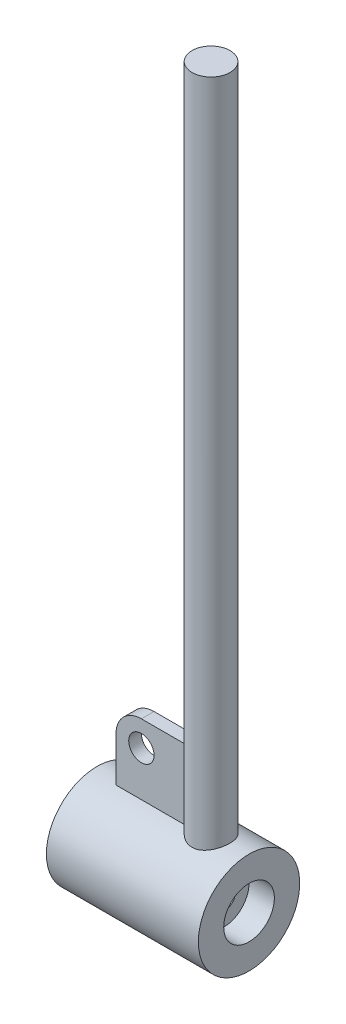
ISO-10303-21;
HEADER;
FILE_DESCRIPTION(('STEP AP214'),'2;1');
FILE_NAME('part.step','',(''),(''),'','','');
FILE_SCHEMA(('AUTOMOTIVE_DESIGN { 1 0 10303 214 1 1 1 1 }'));
ENDSEC;
DATA;
#1=APPLICATION_CONTEXT('core data for automotive mechanical design processes');
#2=APPLICATION_PROTOCOL_DEFINITION('international standard','automotive_design',2000,#1);
#3=PRODUCT_CONTEXT('',#1,'mechanical');
#4=PRODUCT('Part','Part','',(#3));
#5=PRODUCT_RELATED_PRODUCT_CATEGORY('part','',(#4));
#6=PRODUCT_DEFINITION_FORMATION('','',#4);
#7=PRODUCT_DEFINITION_CONTEXT('part definition',#1,'design');
#8=PRODUCT_DEFINITION('design','',#6,#7);
#9=PRODUCT_DEFINITION_SHAPE('','',#8);
#10=(LENGTH_UNIT() NAMED_UNIT(*) SI_UNIT(.MILLI.,.METRE.));
#11=(NAMED_UNIT(*) PLANE_ANGLE_UNIT() SI_UNIT($,.RADIAN.));
#12=(NAMED_UNIT(*) SI_UNIT($,.STERADIAN.) SOLID_ANGLE_UNIT());
#13=UNCERTAINTY_MEASURE_WITH_UNIT(LENGTH_MEASURE(1.E-05),#10,'distance_accuracy_value','');
#14=(GEOMETRIC_REPRESENTATION_CONTEXT(3) GLOBAL_UNCERTAINTY_ASSIGNED_CONTEXT((#13)) GLOBAL_UNIT_ASSIGNED_CONTEXT((#10,
#11,#12)) REPRESENTATION_CONTEXT('',''));
#15=CARTESIAN_POINT('',(0.,0.,0.));
#16=DIRECTION('',(0.,0.,1.));
#17=DIRECTION('',(1.,0.,0.));
#18=AXIS2_PLACEMENT_3D('',#15,#16,#17);
#19=CARTESIAN_POINT('',(-28.575,6.35,0.));
#20=DIRECTION('',(1.,0.,0.));
#21=DIRECTION('',(0.,0.,-1.));
#22=AXIS2_PLACEMENT_3D('',#19,#20,#21);
#23=PLANE('',#22);
#24=CARTESIAN_POINT('',(-28.575,0.,0.));
#25=DIRECTION('',(-1.,0.,0.));
#26=DIRECTION('',(0.,0.,1.));
#27=AXIS2_PLACEMENT_3D('',#24,#25,#26);
#28=CIRCLE('',#27,6.35);
#29=CARTESIAN_POINT('',(-28.575,0.,6.35));
#30=VERTEX_POINT('',#29);
#31=EDGE_CURVE('E119',#30,#30,#28,.T.);
#32=ORIENTED_EDGE('',*,*,#31,.F.);
#33=EDGE_LOOP('',(#32));
#34=FACE_BOUND('',#33,.T.);
#35=CARTESIAN_POINT('',(-28.575,0.,0.));
#36=DIRECTION('',(-1.,0.,0.));
#37=DIRECTION('',(0.,0.,1.));
#38=AXIS2_PLACEMENT_3D('',#35,#36,#37);
#39=CIRCLE('',#38,12.7);
#40=CARTESIAN_POINT('',(-28.575,0.,12.7));
#41=VERTEX_POINT('',#40);
#42=EDGE_CURVE('E165',#41,#41,#39,.T.);
#43=ORIENTED_EDGE('',*,*,#42,.T.);
#44=EDGE_LOOP('',(#43));
#45=FACE_BOUND('',#44,.T.);
#46=ADVANCED_FACE('F31',(#34,#45),#23,.F.);
#47=CARTESIAN_POINT('',(-58.6433500715651,0.,0.));
#48=DIRECTION('',(-1.,0.,0.));
#49=DIRECTION('',(0.,0.,1.));
#50=AXIS2_PLACEMENT_3D('',#47,#48,#49);
#51=CYLINDRICAL_SURFACE('',#50,12.7);
#52=CARTESIAN_POINT('',(0.,11.7732150982644,4.7625));
#53=CARTESIAN_POINT('',(0.128567071697956,11.7732145312841,4.76250062113983));
#54=CARTESIAN_POINT('',(0.257125703016878,11.7753267257476,4.75728965945919));
#55=CARTESIAN_POINT('',(0.513310022643079,11.7837043708982,4.7365006159302));
#56=CARTESIAN_POINT('',(0.640935395208131,11.7899711669087,4.72091917595606));
#57=CARTESIAN_POINT('',(0.894202915787573,11.8064485749458,4.67955822512454));
#58=CARTESIAN_POINT('',(1.01984589820061,11.8166574789881,4.65378313072177));
#59=CARTESIAN_POINT('',(1.26836519243568,11.8406941266636,4.59228170841132));
#60=CARTESIAN_POINT('',(1.39124038812537,11.8545233027994,4.55655144098841));
#61=CARTESIAN_POINT('',(1.63302026727132,11.8853277367461,4.47558411204013));
#62=CARTESIAN_POINT('',(1.75193522703316,11.9022939569003,4.43037431163132));
#63=CARTESIAN_POINT('',(1.98544395373294,11.9388968297245,4.33076841493963));
#64=CARTESIAN_POINT('',(2.10003608583932,11.9585344800118,4.27636888500565));
#65=CARTESIAN_POINT('',(2.43627441928944,12.0206332426824,4.09999159534038));
#66=CARTESIAN_POINT('',(2.65055933236497,12.066303970892,3.96477550461342));
#67=CARTESIAN_POINT('',(3.06356428259551,12.163543145445,3.65589073750445));
#68=CARTESIAN_POINT('',(3.26114315336497,12.2152848534884,3.48076037525215));
#69=CARTESIAN_POINT('',(3.62495986264481,12.3174033347767,3.10006102046914));
#70=CARTESIAN_POINT('',(3.7911910157797,12.3677798149089,2.89448555171005));
#71=CARTESIAN_POINT('',(4.09302078565285,12.463554098497,2.45012934039051));
#72=CARTESIAN_POINT('',(4.22738459037625,12.5087241627453,2.21045674015049));
#73=CARTESIAN_POINT('',(4.45341671487642,12.5869066593033,1.70991489416189));
#74=CARTESIAN_POINT('',(4.54509984218674,12.6199233072573,1.44905303670965));
#75=CARTESIAN_POINT('',(4.67918150939357,12.6688436566044,0.925478579929677));
#76=CARTESIAN_POINT('',(4.72353526802282,12.685424064373,0.663331130000924));
#77=CARTESIAN_POINT('',(4.76796476211752,12.7020324416252,0.134824376409631));
#78=CARTESIAN_POINT('',(4.76805489562662,12.7020657935245,-0.131533529485931));
#79=CARTESIAN_POINT('',(4.72509292000223,12.6860066940157,-0.646885754541797));
#80=CARTESIAN_POINT('',(4.68417498240438,12.6707119588141,-0.896087167420274));
#81=CARTESIAN_POINT('',(4.56394846576677,12.6267614786799,-1.38378951567748));
#82=CARTESIAN_POINT('',(4.48463716815508,12.598104787614,-1.62228969201198));
#83=CARTESIAN_POINT('',(4.28888381685542,12.5297491711813,-2.0859401303221));
#84=CARTESIAN_POINT('',(4.17191823351315,12.4898956281952,-2.31084562059769));
#85=CARTESIAN_POINT('',(3.90464009200877,12.4031790996323,-2.73839498017975));
#86=CARTESIAN_POINT('',(3.75431677688411,12.3563138545638,-2.94103163680303));
#87=CARTESIAN_POINT('',(3.41430836608794,12.2571678165392,-3.33086229554757));
#88=CARTESIAN_POINT('',(3.22283481769307,12.2047305993449,-3.5164590109288));
#89=CARTESIAN_POINT('',(2.81116724632091,12.1025431256601,-3.85351005960945));
#90=CARTESIAN_POINT('',(2.59096603209199,12.0527935463766,-4.00495581808559));
#91=CARTESIAN_POINT('',(2.12179069027205,11.9606283355181,-4.27245817380878));
#92=CARTESIAN_POINT('',(1.8722864055456,11.918399997197,-4.38765466511856));
#93=CARTESIAN_POINT('',(1.35541948774059,11.8482249228897,-4.57379274977756));
#94=CARTESIAN_POINT('',(1.08806688394957,11.8202702414014,-4.64475896899297));
#95=CARTESIAN_POINT('',(0.558876311393927,11.7836822147864,-4.73678857282724));
#96=CARTESIAN_POINT('',(0.297547935141986,11.7740679397346,-4.76038924588605));
#97=CARTESIAN_POINT('',(-0.225454677881716,11.7724726216055,-4.76433791985004));
#98=CARTESIAN_POINT('',(-0.487128811889495,11.7804871720852,-4.74469672934732));
#99=CARTESIAN_POINT('',(-0.990377608832013,11.8122503955975,-4.66501885864571));
#100=CARTESIAN_POINT('',(-1.23231674129102,11.8352341250036,-4.60694397296307));
#101=CARTESIAN_POINT('',(-1.70290433916944,11.8934383585691,-4.45451850412389));
#102=CARTESIAN_POINT('',(-1.9315500705441,11.9286613696537,-4.36016048881079));
#103=CARTESIAN_POINT('',(-2.37859858052653,12.0090011254105,-4.13385673094159));
#104=CARTESIAN_POINT('',(-2.59629615800392,12.0544392355119,-4.00063463273473));
#105=CARTESIAN_POINT('',(-3.00712885943932,12.1495428100892,-3.70178402231716));
#106=CARTESIAN_POINT('',(-3.20025495084908,12.1992098179852,-3.53614364952475));
#107=CARTESIAN_POINT('',(-3.56925706882868,12.3010053631771,-3.1645708368274));
#108=CARTESIAN_POINT('',(-3.74326346164424,12.353090349699,-2.95674982098713));
#109=CARTESIAN_POINT('',(-3.97631066699626,12.4263515418137,-2.62464031005532));
#110=CARTESIAN_POINT('',(-4.04936630002418,12.4499729561772,-2.51046996452995));
#111=CARTESIAN_POINT('',(-4.18564094214861,12.4949607835956,-2.2759985402175));
#112=CARTESIAN_POINT('',(-4.24886415978381,12.5163281601724,-2.15570011384761));
#113=CARTESIAN_POINT('',(-4.36477232952835,12.5561489522204,-1.91011979704122));
#114=CARTESIAN_POINT('',(-4.4174881475595,12.5746108679449,-1.78485383871892));
#115=CARTESIAN_POINT('',(-4.5121192567724,12.6081662504861,-1.52992166068614));
#116=CARTESIAN_POINT('',(-4.55403906422791,12.6232611254754,-1.40025730672218));
#117=CARTESIAN_POINT('',(-4.62667755064893,12.6496479390933,-1.13747148897498));
#118=CARTESIAN_POINT('',(-4.65739820056305,12.6609405468594,-1.00435063792525));
#119=CARTESIAN_POINT('',(-4.707317545595,12.6793884961223,-0.735684992176872));
#120=CARTESIAN_POINT('',(-4.72651690339667,12.6865440755728,-0.600140337352929));
#121=CARTESIAN_POINT('',(-4.75239956206321,12.696210534001,-0.335718324541035));
#122=CARTESIAN_POINT('',(-4.7597493673703,12.6989686472318,-0.206914815385486));
#123=CARTESIAN_POINT('',(-4.76397338324672,12.7005524118377,0.0509341419371704));
#124=CARTESIAN_POINT('',(-4.76084405043419,12.6993767330534,0.1799796571911));
#125=CARTESIAN_POINT('',(-4.74413751092502,12.6931231336892,0.43723223690838));
#126=CARTESIAN_POINT('',(-4.73056543067894,12.6880471278212,0.565439681653922));
#127=CARTESIAN_POINT('',(-4.69311156673808,12.6741306799379,0.820178177797611));
#128=CARTESIAN_POINT('',(-4.66922593453978,12.6652888327151,0.946708585225341));
#129=CARTESIAN_POINT('',(-4.61209197026178,12.6443385182719,1.19403273974648));
#130=CARTESIAN_POINT('',(-4.57909087016833,12.632316623007,1.31489091690869));
#131=CARTESIAN_POINT('',(-4.50379829019273,12.6052199149912,1.55334016121475));
#132=CARTESIAN_POINT('',(-4.46150353178256,12.590144025028,1.6709300588742));
#133=CARTESIAN_POINT('',(-4.32118124063063,12.54087136727,2.01762985113728));
#134=CARTESIAN_POINT('',(-4.20966803825519,12.5026113923019,2.24087422991891));
#135=CARTESIAN_POINT('',(-3.94870025045316,12.4171262601616,2.67509686374011));
#136=CARTESIAN_POINT('',(-3.79784779812465,12.3695918470072,2.88516501113685));
#137=CARTESIAN_POINT('',(-3.46450599698104,12.2713528934447,3.27793828956063));
#138=CARTESIAN_POINT('',(-3.2820053554771,12.2206472256143,3.46063360990953));
#139=CARTESIAN_POINT('',(-2.98271188999078,12.1447591216353,3.71527585956508));
#140=CARTESIAN_POINT('',(-2.87567460182391,12.1188495007057,3.79872983832756));
#141=CARTESIAN_POINT('',(-2.65467810349326,12.0683201567412,3.95632167488787));
#142=CARTESIAN_POINT('',(-2.54072142154515,12.0436999686235,4.03046290536328));
#143=CARTESIAN_POINT('',(-2.30650931168393,11.996475172104,4.16892604941795));
#144=CARTESIAN_POINT('',(-2.18625041172596,11.973871693687,4.23324247224255));
#145=CARTESIAN_POINT('',(-1.94030971207018,11.9314179605253,4.35146058322779));
#146=CARTESIAN_POINT('',(-1.8146302560724,11.9115665312103,4.40536671836816));
#147=CARTESIAN_POINT('',(-1.55296210797897,11.8744592463703,4.50445839152832));
#148=CARTESIAN_POINT('',(-1.41676351234131,11.857358108399,4.54914941369043));
#149=CARTESIAN_POINT('',(-1.14050214350071,11.8275312228954,4.62614444378897));
#150=CARTESIAN_POINT('',(-1.00044113763013,11.8148035089466,4.65845401953312));
#151=CARTESIAN_POINT('',(-0.717663951605386,11.7942256979845,4.71031003474577));
#152=CARTESIAN_POINT('',(-0.574948616409466,11.7863740752276,4.72986046668673));
#153=CARTESIAN_POINT('',(-0.288151879879898,11.7758693975702,4.7559543393551));
#154=CARTESIAN_POINT('',(-0.14407064057994,11.7732157336153,4.76249930395854));
#155=CARTESIAN_POINT('',(0.,11.7732150982644,4.7625));
#156=B_SPLINE_CURVE_WITH_KNOTS('',3,(#52,#53,#54,#55,#56,#57,#58,#59,#60,#61,#62,#63,#64,#65,
#66,#67,#68,#69,#70,#71,#72,#73,#74,#75,#76,#77,#78,#79,#80,#81,#82,#83,#84,#85,#86,#87,#88,#89,
#90,#91,#92,#93,#94,#95,#96,#97,#98,#99,#100,#101,#102,#103,#104,#105,#106,#107,#108,#109,#110,
#111,#112,#113,#114,#115,#116,#117,#118,#119,#120,#121,#122,#123,#124,#125,#126,#127,#128,#129,
#130,#131,#132,#133,#134,#135,#136,#137,#138,#139,#140,#141,#142,#143,#144,#145,#146,#147,#148,
#149,#150,#151,#152,#153,#154,#155),.UNSPECIFIED.,.T.,.F.,(4,2,2,2,2,2,2,2,2,2,2,2,2,2,2,2,2,2,
2,2,2,2,2,2,2,2,2,2,2,2,2,2,2,2,2,2,2,2,2,2,2,2,2,2,2,2,2,2,2,2,2,4),(0.,0.385564476088822,
0.771253864869272,1.1567763344256,1.54245158224518,1.92703255959014,2.31175755091278,
3.08064991370253,3.88429271944502,4.68810672083892,5.51927229604059,6.35014929331645,
7.14518809275653,7.93996828231343,8.69542801721063,9.45094125282011,10.2174486716479,
10.9842036284292,11.7958219390507,12.6076438092271,13.4374848098029,14.2668633702728,
15.0504821391069,15.8339050594435,16.5801396140668,17.3265271072339,18.1008920677813,
18.8755408696532,19.699296795394,20.1116447447046,20.5238157093198,20.934757457806,
21.3455270175791,21.756224250752,22.1668978590998,22.5535462570369,22.9403254082121,
23.3269148066294,23.7136485857759,24.0907786666169,24.4680420020059,25.2219441489147,
26.0075375791267,26.7934119032975,27.2075335208358,27.6215047262162,28.03570644637,
28.4497308380086,28.8821701770378,29.3144148237546,29.7465241515697,30.1785828453034),.UNSPECIFIED.);
#157=CARTESIAN_POINT('',(-4.49012806053458,12.6003906189451,1.5875));
#158=VERTEX_POINT('',#157);
#159=CARTESIAN_POINT('',(-4.49012806053458,12.6003906189451,-1.5875));
#160=VERTEX_POINT('',#159);
#161=EDGE_CURVE('E112',#158,#160,#156,.T.);
#162=ORIENTED_EDGE('',*,*,#161,.F.);
#163=DIRECTION('',(-1.,0.,0.));
#164=VECTOR('',#163,1.);
#165=CARTESIAN_POINT('',(-58.6433500715651,12.6003906189451,1.5875));
#166=LINE('',#165,#164);
#167=CARTESIAN_POINT('',(-22.225,12.6003906189451,1.5875));
#168=VERTEX_POINT('',#167);
#169=EDGE_CURVE('E54',#158,#168,#166,.T.);
#170=ORIENTED_EDGE('',*,*,#169,.T.);
#171=CARTESIAN_POINT('',(-22.225,0.,0.));
#172=DIRECTION('',(1.,0.,0.));
#173=DIRECTION('',(0.,1.,0.));
#174=AXIS2_PLACEMENT_3D('',#171,#172,#173);
#175=CIRCLE('',#174,12.7);
#176=CARTESIAN_POINT('',(-22.225,12.6003906189451,-1.5875));
#177=VERTEX_POINT('',#176);
#178=EDGE_CURVE('E11',#177,#168,#175,.T.);
#179=ORIENTED_EDGE('',*,*,#178,.F.);
#180=DIRECTION('',(-1.,0.,0.));
#181=VECTOR('',#180,1.);
#182=CARTESIAN_POINT('',(-58.6433500715651,12.6003906189451,-1.5875));
#183=LINE('',#182,#181);
#184=EDGE_CURVE('E90',#160,#177,#183,.T.);
#185=ORIENTED_EDGE('',*,*,#184,.F.);
#186=EDGE_LOOP('',(#162,#170,#179,#185));
#187=FACE_BOUND('',#186,.T.);
#188=ORIENTED_EDGE('',*,*,#42,.F.);
#189=EDGE_LOOP('',(#188));
#190=FACE_BOUND('',#189,.T.);
#191=CARTESIAN_POINT('',(9.52500000000001,0.,0.));
#192=DIRECTION('',(-1.,0.,0.));
#193=DIRECTION('',(0.,0.,1.));
#194=AXIS2_PLACEMENT_3D('',#191,#192,#193);
#195=CIRCLE('',#194,12.7);
#196=CARTESIAN_POINT('',(9.52500000000001,0.,12.7));
#197=VERTEX_POINT('',#196);
#198=EDGE_CURVE('E168',#197,#197,#195,.T.);
#199=ORIENTED_EDGE('',*,*,#198,.T.);
#200=EDGE_LOOP('',(#199));
#201=FACE_BOUND('',#200,.T.);
#202=ADVANCED_FACE('F153',(#187,#190,#201),#51,.T.);
#203=CARTESIAN_POINT('',(9.525,12.7,0.));
#204=DIRECTION('',(-1.,0.,0.));
#205=DIRECTION('',(0.,0.,1.));
#206=AXIS2_PLACEMENT_3D('',#203,#204,#205);
#207=PLANE('',#206);
#208=ORIENTED_EDGE('',*,*,#198,.F.);
#209=EDGE_LOOP('',(#208));
#210=FACE_BOUND('',#209,.T.);
#211=CARTESIAN_POINT('',(9.52500000000001,0.,0.));
#212=DIRECTION('',(-1.,0.,0.));
#213=DIRECTION('',(0.,0.,1.));
#214=AXIS2_PLACEMENT_3D('',#211,#212,#213);
#215=CIRCLE('',#214,6.35);
#216=CARTESIAN_POINT('',(9.52500000000001,0.,6.35));
#217=VERTEX_POINT('',#216);
#218=EDGE_CURVE('E174',#217,#217,#215,.T.);
#219=ORIENTED_EDGE('',*,*,#218,.T.);
#220=EDGE_LOOP('',(#219));
#221=FACE_BOUND('',#220,.T.);
#222=ADVANCED_FACE('F158',(#210,#221),#207,.F.);
#223=CARTESIAN_POINT('',(-58.6433500715651,0.,0.));
#224=DIRECTION('',(-1.,0.,0.));
#225=DIRECTION('',(0.,0.,1.));
#226=AXIS2_PLACEMENT_3D('',#223,#224,#225);
#227=CYLINDRICAL_SURFACE('',#226,6.35);
#228=ORIENTED_EDGE('',*,*,#218,.F.);
#229=EDGE_LOOP('',(#228));
#230=FACE_BOUND('',#229,.T.);
#231=CARTESIAN_POINT('',(3.175,0.,0.));
#232=DIRECTION('',(-1.,0.,0.));
#233=DIRECTION('',(0.,0.,1.));
#234=AXIS2_PLACEMENT_3D('',#231,#232,#233);
#235=CIRCLE('',#234,6.35);
#236=CARTESIAN_POINT('',(3.175,0.,6.35));
#237=VERTEX_POINT('',#236);
#238=EDGE_CURVE('E195',#237,#237,#235,.T.);
#239=ORIENTED_EDGE('',*,*,#238,.T.);
#240=EDGE_LOOP('',(#239));
#241=FACE_BOUND('',#240,.T.);
#242=ADVANCED_FACE('F190',(#230,#241),#227,.F.);
#243=CARTESIAN_POINT('',(3.175,6.35,0.));
#244=DIRECTION('',(-1.,0.,0.));
#245=DIRECTION('',(0.,0.,1.));
#246=AXIS2_PLACEMENT_3D('',#243,#244,#245);
#247=PLANE('',#246);
#248=ORIENTED_EDGE('',*,*,#238,.F.);
#249=EDGE_LOOP('',(#248));
#250=FACE_BOUND('',#249,.T.);
#251=CARTESIAN_POINT('',(3.175,0.,0.));
#252=DIRECTION('',(-1.,0.,0.));
#253=DIRECTION('',(0.,0.,1.));
#254=AXIS2_PLACEMENT_3D('',#251,#252,#253);
#255=CIRCLE('',#254,3.01625);
#256=CARTESIAN_POINT('',(3.175,0.,3.01625));
#257=VERTEX_POINT('',#256);
#258=EDGE_CURVE('E197',#257,#257,#255,.T.);
#259=ORIENTED_EDGE('',*,*,#258,.T.);
#260=EDGE_LOOP('',(#259));
#261=FACE_BOUND('',#260,.T.);
#262=ADVANCED_FACE('F223',(#250,#261),#247,.F.);
#263=CARTESIAN_POINT('',(-58.6433500715651,0.,0.));
#264=DIRECTION('',(-1.,0.,0.));
#265=DIRECTION('',(0.,0.,1.));
#266=AXIS2_PLACEMENT_3D('',#263,#264,#265);
#267=CYLINDRICAL_SURFACE('',#266,3.01625);
#268=ORIENTED_EDGE('',*,*,#258,.F.);
#269=EDGE_LOOP('',(#268));
#270=FACE_BOUND('',#269,.T.);
#271=CARTESIAN_POINT('',(-15.875,0.,0.));
#272=DIRECTION('',(-1.,0.,0.));
#273=DIRECTION('',(0.,0.,1.));
#274=AXIS2_PLACEMENT_3D('',#271,#272,#273);
#275=CIRCLE('',#274,3.01625);
#276=CARTESIAN_POINT('',(-15.875,0.,3.01625));
#277=VERTEX_POINT('',#276);
#278=EDGE_CURVE('E202',#277,#277,#275,.T.);
#279=ORIENTED_EDGE('',*,*,#278,.T.);
#280=EDGE_LOOP('',(#279));
#281=FACE_BOUND('',#280,.T.);
#282=ADVANCED_FACE('F217',(#270,#281),#267,.F.);
#283=CARTESIAN_POINT('',(-15.875,3.01625,0.));
#284=DIRECTION('',(1.,0.,0.));
#285=DIRECTION('',(0.,0.,-1.));
#286=AXIS2_PLACEMENT_3D('',#283,#284,#285);
#287=PLANE('',#286);
#288=ORIENTED_EDGE('',*,*,#278,.F.);
#289=EDGE_LOOP('',(#288));
#290=FACE_BOUND('',#289,.T.);
#291=CARTESIAN_POINT('',(-15.875,0.,0.));
#292=DIRECTION('',(-1.,0.,0.));
#293=DIRECTION('',(0.,0.,1.));
#294=AXIS2_PLACEMENT_3D('',#291,#292,#293);
#295=CIRCLE('',#294,6.35);
#296=CARTESIAN_POINT('',(-15.875,0.,6.35));
#297=VERTEX_POINT('',#296);
#298=EDGE_CURVE('E204',#297,#297,#295,.T.);
#299=ORIENTED_EDGE('',*,*,#298,.T.);
#300=EDGE_LOOP('',(#299));
#301=FACE_BOUND('',#300,.T.);
#302=ADVANCED_FACE('F211',(#290,#301),#287,.F.);
#303=CARTESIAN_POINT('',(-58.6433500715651,0.,0.));
#304=DIRECTION('',(-1.,0.,0.));
#305=DIRECTION('',(0.,0.,1.));
#306=AXIS2_PLACEMENT_3D('',#303,#304,#305);
#307=CYLINDRICAL_SURFACE('',#306,6.35);
#308=ORIENTED_EDGE('',*,*,#298,.F.);
#309=EDGE_LOOP('',(#308));
#310=FACE_BOUND('',#309,.T.);
#311=ORIENTED_EDGE('',*,*,#31,.T.);
#312=EDGE_LOOP('',(#311));
#313=FACE_BOUND('',#312,.T.);
#314=ADVANCED_FACE('F209',(#310,#313),#307,.F.);
#315=CARTESIAN_POINT('',(0.,-500000.,0.));
#316=DIRECTION('',(0.,1.,0.));
#317=DIRECTION('',(0.,0.,1.));
#318=AXIS2_PLACEMENT_3D('',#315,#316,#317);
#319=CYLINDRICAL_SURFACE('',#318,4.7625);
#320=DIRECTION('',(0.,1.,0.));
#321=VECTOR('',#320,1.);
#322=CARTESIAN_POINT('',(-4.49012806053458,-500000.,1.5875));
#323=LINE('',#322,#321);
#324=CARTESIAN_POINT('',(-4.49012806053458,30.1625,1.5875));
#325=VERTEX_POINT('',#324);
#326=EDGE_CURVE('E39',#158,#325,#323,.T.);
#327=ORIENTED_EDGE('',*,*,#326,.F.);
#328=ORIENTED_EDGE('',*,*,#161,.T.);
#329=DIRECTION('',(0.,1.,0.));
#330=VECTOR('',#329,1.);
#331=CARTESIAN_POINT('',(-4.49012806053458,-500000.,-1.5875));
#332=LINE('',#331,#330);
#333=CARTESIAN_POINT('',(-4.49012806053458,30.1625000000172,-1.5875));
#334=VERTEX_POINT('',#333);
#335=EDGE_CURVE('E167',#160,#334,#332,.T.);
#336=ORIENTED_EDGE('',*,*,#335,.T.);
#337=CARTESIAN_POINT('',(0.,30.1625000000172,0.));
#338=DIRECTION('',(0.,-1.,0.));
#339=DIRECTION('',(1.,0.,0.));
#340=AXIS2_PLACEMENT_3D('',#337,#338,#339);
#341=CIRCLE('',#340,4.7625);
#342=EDGE_CURVE('E171',#334,#325,#341,.F.);
#343=ORIENTED_EDGE('',*,*,#342,.T.);
#344=EDGE_LOOP('',(#327,#328,#336,#343));
#345=FACE_BOUND('',#344,.T.);
#346=CARTESIAN_POINT('',(0.,180.,0.));
#347=DIRECTION('',(0.,1.,0.));
#348=DIRECTION('',(0.,0.,1.));
#349=AXIS2_PLACEMENT_3D('',#346,#347,#348);
#350=CIRCLE('',#349,4.7625);
#351=CARTESIAN_POINT('',(0.,180.,4.7625));
#352=VERTEX_POINT('',#351);
#353=EDGE_CURVE('E109',#352,#352,#350,.T.);
#354=ORIENTED_EDGE('',*,*,#353,.F.);
#355=EDGE_LOOP('',(#354));
#356=FACE_BOUND('',#355,.T.);
#357=ADVANCED_FACE('F121',(#345,#356),#319,.T.);
#358=CARTESIAN_POINT('',(0.,180.,0.));
#359=DIRECTION('',(0.,1.,0.));
#360=DIRECTION('',(0.,0.,1.));
#361=AXIS2_PLACEMENT_3D('',#358,#359,#360);
#362=PLANE('',#361);
#363=ORIENTED_EDGE('',*,*,#353,.T.);
#364=EDGE_LOOP('',(#363));
#365=FACE_BOUND('',#364,.T.);
#366=ADVANCED_FACE('F126',(#365),#362,.T.);
#367=CARTESIAN_POINT('',(-22.225,11.1125,1.5875));
#368=DIRECTION('',(1.,0.,0.));
#369=DIRECTION('',(0.,1.,0.));
#370=AXIS2_PLACEMENT_3D('',#367,#368,#369);
#371=PLANE('',#370);
#372=DIRECTION('',(0.,-1.,0.));
#373=VECTOR('',#372,1.);
#374=CARTESIAN_POINT('',(-22.225,11.1125,-1.5875));
#375=LINE('',#374,#373);
#376=CARTESIAN_POINT('',(-22.225,23.8125,-1.5875));
#377=VERTEX_POINT('',#376);
#378=EDGE_CURVE('E84',#377,#177,#375,.T.);
#379=ORIENTED_EDGE('',*,*,#378,.T.);
#380=ORIENTED_EDGE('',*,*,#178,.T.);
#381=DIRECTION('',(0.,-1.,0.));
#382=VECTOR('',#381,1.);
#383=CARTESIAN_POINT('',(-22.225,11.1125,1.5875));
#384=LINE('',#383,#382);
#385=CARTESIAN_POINT('',(-22.225,23.8125,1.5875));
#386=VERTEX_POINT('',#385);
#387=EDGE_CURVE('E96',#386,#168,#384,.T.);
#388=ORIENTED_EDGE('',*,*,#387,.F.);
#389=DIRECTION('',(0.,0.,-1.));
#390=VECTOR('',#389,1.);
#391=CARTESIAN_POINT('',(-22.225,23.8125,1.5875));
#392=LINE('',#391,#390);
#393=EDGE_CURVE('E91',#386,#377,#392,.T.);
#394=ORIENTED_EDGE('',*,*,#393,.T.);
#395=EDGE_LOOP('',(#379,#380,#388,#394));
#396=FACE_BOUND('',#395,.T.);
#397=ADVANCED_FACE('F129',(#396),#371,.F.);
#398=CARTESIAN_POINT('',(-15.875,23.8125,1.5875));
#399=DIRECTION('',(0.,0.,1.));
#400=DIRECTION('',(1.,0.,0.));
#401=AXIS2_PLACEMENT_3D('',#398,#399,#400);
#402=PLANE('',#401);
#403=CARTESIAN_POINT('',(-15.875,23.8125,1.5875));
#404=DIRECTION('',(0.,0.,1.));
#405=DIRECTION('',(1.,0.,0.));
#406=AXIS2_PLACEMENT_3D('',#403,#404,#405);
#407=CIRCLE('',#406,3.175);
#408=CARTESIAN_POINT('',(-12.7,23.8125,1.5875));
#409=VERTEX_POINT('',#408);
#410=EDGE_CURVE('E327',#409,#409,#407,.T.);
#411=ORIENTED_EDGE('',*,*,#410,.F.);
#412=EDGE_LOOP('',(#411));
#413=FACE_BOUND('',#412,.T.);
#414=ORIENTED_EDGE('',*,*,#169,.F.);
#415=ORIENTED_EDGE('',*,*,#326,.T.);
#416=DIRECTION('',(-1.,0.,0.));
#417=VECTOR('',#416,1.);
#418=CARTESIAN_POINT('',(-3.175,30.1625,1.5875));
#419=LINE('',#418,#417);
#420=CARTESIAN_POINT('',(-15.875,30.1625,1.5875));
#421=VERTEX_POINT('',#420);
#422=EDGE_CURVE('E76',#325,#421,#419,.T.);
#423=ORIENTED_EDGE('',*,*,#422,.T.);
#424=CARTESIAN_POINT('',(-15.875,23.8125,1.5875));
#425=DIRECTION('',(0.,0.,1.));
#426=DIRECTION('',(1.,0.,0.));
#427=AXIS2_PLACEMENT_3D('',#424,#425,#426);
#428=CIRCLE('',#427,6.35);
#429=EDGE_CURVE('E80',#421,#386,#428,.T.);
#430=ORIENTED_EDGE('',*,*,#429,.T.);
#431=ORIENTED_EDGE('',*,*,#387,.T.);
#432=EDGE_LOOP('',(#414,#415,#423,#430,#431));
#433=FACE_BOUND('',#432,.T.);
#434=ADVANCED_FACE('F78',(#413,#433),#402,.T.);
#435=CARTESIAN_POINT('',(-15.875,23.8125,-1.5875));
#436=DIRECTION('',(0.,0.,1.));
#437=DIRECTION('',(1.,0.,0.));
#438=AXIS2_PLACEMENT_3D('',#435,#436,#437);
#439=PLANE('',#438);
#440=CARTESIAN_POINT('',(-15.875,23.8125,-1.5875));
#441=DIRECTION('',(0.,0.,1.));
#442=DIRECTION('',(1.,0.,0.));
#443=AXIS2_PLACEMENT_3D('',#440,#441,#442);
#444=CIRCLE('',#443,3.175);
#445=CARTESIAN_POINT('',(-12.7,23.8125,-1.5875));
#446=VERTEX_POINT('',#445);
#447=EDGE_CURVE('E34',#446,#446,#444,.T.);
#448=ORIENTED_EDGE('',*,*,#447,.T.);
#449=EDGE_LOOP('',(#448));
#450=FACE_BOUND('',#449,.T.);
#451=ORIENTED_EDGE('',*,*,#335,.F.);
#452=ORIENTED_EDGE('',*,*,#184,.T.);
#453=ORIENTED_EDGE('',*,*,#378,.F.);
#454=CARTESIAN_POINT('',(-15.875,23.8125,-1.5875));
#455=DIRECTION('',(0.,0.,1.));
#456=DIRECTION('',(1.,0.,0.));
#457=AXIS2_PLACEMENT_3D('',#454,#455,#456);
#458=CIRCLE('',#457,6.35);
#459=CARTESIAN_POINT('',(-15.875,30.1625,-1.5875));
#460=VERTEX_POINT('',#459);
#461=EDGE_CURVE('E102',#460,#377,#458,.T.);
#462=ORIENTED_EDGE('',*,*,#461,.F.);
#463=DIRECTION('',(-1.,0.,0.));
#464=VECTOR('',#463,1.);
#465=CARTESIAN_POINT('',(-3.175,30.1625,-1.5875));
#466=LINE('',#465,#464);
#467=EDGE_CURVE('E46',#334,#460,#466,.T.);
#468=ORIENTED_EDGE('',*,*,#467,.F.);
#469=EDGE_LOOP('',(#451,#452,#453,#462,#468));
#470=FACE_BOUND('',#469,.T.);
#471=ADVANCED_FACE('F133',(#450,#470),#439,.F.);
#472=CARTESIAN_POINT('',(-3.175,30.1625,1.5875));
#473=DIRECTION('',(0.,-1.,0.));
#474=DIRECTION('',(1.,0.,0.));
#475=AXIS2_PLACEMENT_3D('',#472,#473,#474);
#476=PLANE('',#475);
#477=ORIENTED_EDGE('',*,*,#342,.F.);
#478=ORIENTED_EDGE('',*,*,#467,.T.);
#479=DIRECTION('',(0.,0.,-1.));
#480=VECTOR('',#479,1.);
#481=CARTESIAN_POINT('',(-15.875,30.1625,1.5875));
#482=LINE('',#481,#480);
#483=EDGE_CURVE('E87',#421,#460,#482,.T.);
#484=ORIENTED_EDGE('',*,*,#483,.F.);
#485=ORIENTED_EDGE('',*,*,#422,.F.);
#486=EDGE_LOOP('',(#477,#478,#484,#485));
#487=FACE_BOUND('',#486,.T.);
#488=ADVANCED_FACE('F88',(#487),#476,.F.);
#489=CARTESIAN_POINT('',(-15.875,23.8125,1.5875));
#490=DIRECTION('',(0.,0.,-1.));
#491=DIRECTION('',(-1.,0.,0.));
#492=AXIS2_PLACEMENT_3D('',#489,#490,#491);
#493=CYLINDRICAL_SURFACE('',#492,6.35);
#494=ORIENTED_EDGE('',*,*,#461,.T.);
#495=ORIENTED_EDGE('',*,*,#393,.F.);
#496=ORIENTED_EDGE('',*,*,#429,.F.);
#497=ORIENTED_EDGE('',*,*,#483,.T.);
#498=EDGE_LOOP('',(#494,#495,#496,#497));
#499=FACE_BOUND('',#498,.T.);
#500=ADVANCED_FACE('F93',(#499),#493,.T.);
#501=CARTESIAN_POINT('',(-15.875,23.8125,-12.7));
#502=DIRECTION('',(0.,0.,1.));
#503=DIRECTION('',(1.,0.,0.));
#504=AXIS2_PLACEMENT_3D('',#501,#502,#503);
#505=CYLINDRICAL_SURFACE('',#504,3.175);
#506=ORIENTED_EDGE('',*,*,#410,.T.);
#507=EDGE_LOOP('',(#506));
#508=FACE_BOUND('',#507,.T.);
#509=ORIENTED_EDGE('',*,*,#447,.F.);
#510=EDGE_LOOP('',(#509));
#511=FACE_BOUND('',#510,.T.);
#512=ADVANCED_FACE('F136',(#508,#511),#505,.F.);
#513=CLOSED_SHELL('',(#46,#202,#222,#242,#262,#282,#302,#314,#357,#366,#397,#434,#471,#488,#500,#512));
#514=MANIFOLD_SOLID_BREP('B2',#513);
#515=ADVANCED_BREP_SHAPE_REPRESENTATION('',(#18,#514),#14);
#516=SHAPE_DEFINITION_REPRESENTATION(#9,#515);
ENDSEC;
END-ISO-10303-21;
